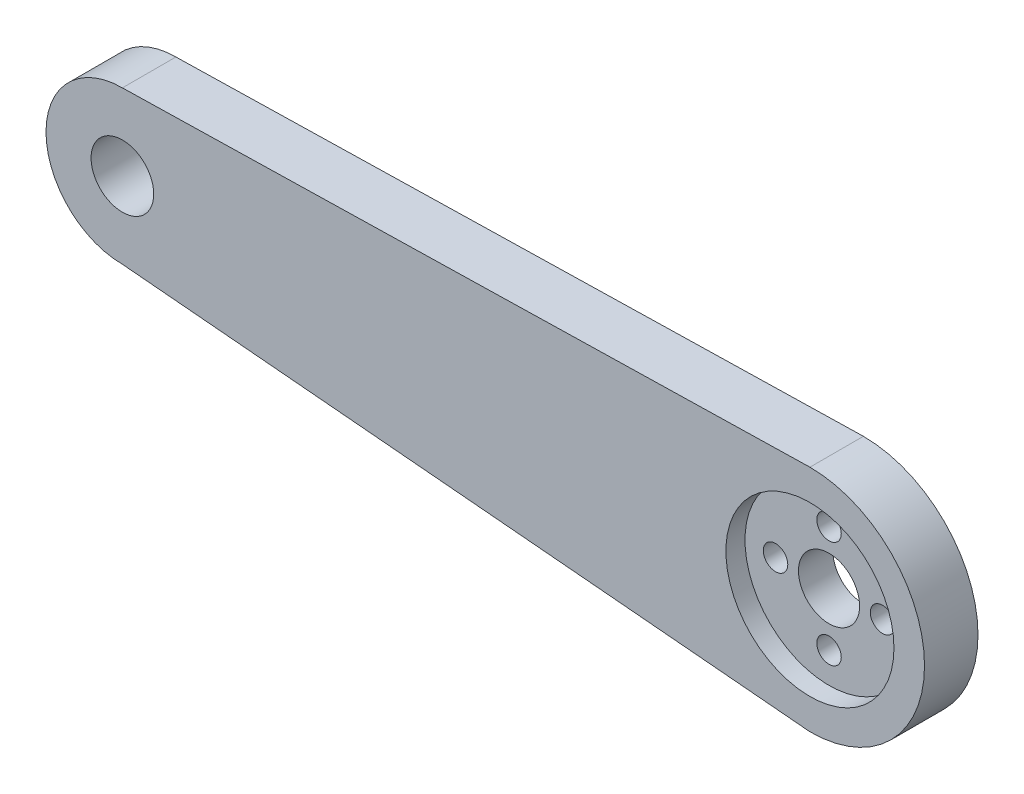
ISO-10303-21;
HEADER;
FILE_DESCRIPTION(('STEP AP214'),'2;1');
FILE_NAME('part.step','',(''),(''),'','','');
FILE_SCHEMA(('AUTOMOTIVE_DESIGN { 1 0 10303 214 1 1 1 1 }'));
ENDSEC;
DATA;
#1=APPLICATION_CONTEXT('core data for automotive mechanical design processes');
#2=APPLICATION_PROTOCOL_DEFINITION('international standard','automotive_design',2000,#1);
#3=PRODUCT_CONTEXT('',#1,'mechanical');
#4=PRODUCT('Part','Part','',(#3));
#5=PRODUCT_RELATED_PRODUCT_CATEGORY('part','',(#4));
#6=PRODUCT_DEFINITION_FORMATION('','',#4);
#7=PRODUCT_DEFINITION_CONTEXT('part definition',#1,'design');
#8=PRODUCT_DEFINITION('design','',#6,#7);
#9=PRODUCT_DEFINITION_SHAPE('','',#8);
#10=(LENGTH_UNIT() NAMED_UNIT(*) SI_UNIT(.MILLI.,.METRE.));
#11=(NAMED_UNIT(*) PLANE_ANGLE_UNIT() SI_UNIT($,.RADIAN.));
#12=(NAMED_UNIT(*) SI_UNIT($,.STERADIAN.) SOLID_ANGLE_UNIT());
#13=UNCERTAINTY_MEASURE_WITH_UNIT(LENGTH_MEASURE(1.E-05),#10,'distance_accuracy_value','');
#14=(GEOMETRIC_REPRESENTATION_CONTEXT(3) GLOBAL_UNCERTAINTY_ASSIGNED_CONTEXT((#13)) GLOBAL_UNIT_ASSIGNED_CONTEXT((#10,
#11,#12)) REPRESENTATION_CONTEXT('',''));
#15=CARTESIAN_POINT('',(0.,0.,0.));
#16=DIRECTION('',(0.,0.,1.));
#17=DIRECTION('',(1.,0.,0.));
#18=AXIS2_PLACEMENT_3D('',#15,#16,#17);
#19=CARTESIAN_POINT('',(90.,-3.00000000000001,10.));
#20=DIRECTION('',(0.,0.,-1.));
#21=DIRECTION('',(-1.,0.,0.));
#22=AXIS2_PLACEMENT_3D('',#19,#20,#21);
#23=CYLINDRICAL_SURFACE('',#22,4.00000000000001);
#24=CARTESIAN_POINT('',(90.,-3.00000000000001,0.));
#25=DIRECTION('',(0.,0.,-1.));
#26=DIRECTION('',(-1.,0.,0.));
#27=AXIS2_PLACEMENT_3D('',#24,#25,#26);
#28=CIRCLE('',#27,4.00000000000001);
#29=CARTESIAN_POINT('',(86.,-3.00000000000001,0.));
#30=VERTEX_POINT('',#29);
#31=EDGE_CURVE('E119',#30,#30,#28,.T.);
#32=ORIENTED_EDGE('',*,*,#31,.T.);
#33=EDGE_LOOP('',(#32));
#34=FACE_BOUND('',#33,.T.);
#35=CARTESIAN_POINT('',(90.,-3.00000000000001,4.5));
#36=DIRECTION('',(0.,0.,1.));
#37=DIRECTION('',(1.,0.,0.));
#38=AXIS2_PLACEMENT_3D('',#35,#36,#37);
#39=CIRCLE('',#38,4.00000000000001);
#40=CARTESIAN_POINT('',(94.,-3.00000000000001,4.5));
#41=VERTEX_POINT('',#40);
#42=EDGE_CURVE('E127',#41,#41,#39,.F.);
#43=ORIENTED_EDGE('',*,*,#42,.F.);
#44=EDGE_LOOP('',(#43));
#45=FACE_BOUND('',#44,.T.);
#46=ADVANCED_FACE('F37',(#34,#45),#23,.F.);
#47=CARTESIAN_POINT('',(90.,3.99999999999999,10.));
#48=DIRECTION('',(0.,0.,-1.));
#49=DIRECTION('',(-1.,0.,0.));
#50=AXIS2_PLACEMENT_3D('',#47,#48,#49);
#51=CYLINDRICAL_SURFACE('',#50,1.60000000000001);
#52=CARTESIAN_POINT('',(90.,3.99999999999999,0.));
#53=DIRECTION('',(0.,0.,-1.));
#54=DIRECTION('',(-1.,0.,0.));
#55=AXIS2_PLACEMENT_3D('',#52,#53,#54);
#56=CIRCLE('',#55,1.60000000000001);
#57=CARTESIAN_POINT('',(88.4,3.99999999999999,0.));
#58=VERTEX_POINT('',#57);
#59=EDGE_CURVE('E126',#58,#58,#56,.T.);
#60=ORIENTED_EDGE('',*,*,#59,.T.);
#61=EDGE_LOOP('',(#60));
#62=FACE_BOUND('',#61,.T.);
#63=CARTESIAN_POINT('',(90.,3.99999999999999,4.5));
#64=DIRECTION('',(0.,0.,1.));
#65=DIRECTION('',(1.,0.,0.));
#66=AXIS2_PLACEMENT_3D('',#63,#64,#65);
#67=CIRCLE('',#66,1.60000000000001);
#68=CARTESIAN_POINT('',(91.6,3.99999999999999,4.5));
#69=VERTEX_POINT('',#68);
#70=EDGE_CURVE('E140',#69,#69,#67,.F.);
#71=ORIENTED_EDGE('',*,*,#70,.F.);
#72=EDGE_LOOP('',(#71));
#73=FACE_BOUND('',#72,.T.);
#74=ADVANCED_FACE('F176',(#62,#73),#51,.F.);
#75=CARTESIAN_POINT('',(83.,-3.00000000000001,10.));
#76=DIRECTION('',(0.,0.,-1.));
#77=DIRECTION('',(-1.,0.,0.));
#78=AXIS2_PLACEMENT_3D('',#75,#76,#77);
#79=CYLINDRICAL_SURFACE('',#78,1.60000000000001);
#80=CARTESIAN_POINT('',(83.,-3.00000000000001,0.));
#81=DIRECTION('',(0.,0.,-1.));
#82=DIRECTION('',(-1.,0.,0.));
#83=AXIS2_PLACEMENT_3D('',#80,#81,#82);
#84=CIRCLE('',#83,1.60000000000001);
#85=CARTESIAN_POINT('',(81.4,-3.00000000000001,0.));
#86=VERTEX_POINT('',#85);
#87=EDGE_CURVE('E131',#86,#86,#84,.T.);
#88=ORIENTED_EDGE('',*,*,#87,.T.);
#89=EDGE_LOOP('',(#88));
#90=FACE_BOUND('',#89,.T.);
#91=CARTESIAN_POINT('',(83.,-3.00000000000001,4.5));
#92=DIRECTION('',(0.,0.,1.));
#93=DIRECTION('',(1.,0.,0.));
#94=AXIS2_PLACEMENT_3D('',#91,#92,#93);
#95=CIRCLE('',#94,1.60000000000001);
#96=CARTESIAN_POINT('',(84.6,-3.00000000000001,4.5));
#97=VERTEX_POINT('',#96);
#98=EDGE_CURVE('E143',#97,#97,#95,.F.);
#99=ORIENTED_EDGE('',*,*,#98,.F.);
#100=EDGE_LOOP('',(#99));
#101=FACE_BOUND('',#100,.T.);
#102=ADVANCED_FACE('F171',(#90,#101),#79,.F.);
#103=CARTESIAN_POINT('',(90.,-10.,10.));
#104=DIRECTION('',(0.,0.,-1.));
#105=DIRECTION('',(-1.,0.,0.));
#106=AXIS2_PLACEMENT_3D('',#103,#104,#105);
#107=CYLINDRICAL_SURFACE('',#106,1.6);
#108=CARTESIAN_POINT('',(90.,-10.,0.));
#109=DIRECTION('',(0.,0.,-1.));
#110=DIRECTION('',(-1.,0.,0.));
#111=AXIS2_PLACEMENT_3D('',#108,#109,#110);
#112=CIRCLE('',#111,1.6);
#113=CARTESIAN_POINT('',(88.4,-10.,0.));
#114=VERTEX_POINT('',#113);
#115=EDGE_CURVE('E128',#114,#114,#112,.T.);
#116=ORIENTED_EDGE('',*,*,#115,.T.);
#117=EDGE_LOOP('',(#116));
#118=FACE_BOUND('',#117,.T.);
#119=CARTESIAN_POINT('',(90.,-10.,4.5));
#120=DIRECTION('',(0.,0.,1.));
#121=DIRECTION('',(1.,0.,0.));
#122=AXIS2_PLACEMENT_3D('',#119,#120,#121);
#123=CIRCLE('',#122,1.6);
#124=CARTESIAN_POINT('',(91.6,-10.,4.5));
#125=VERTEX_POINT('',#124);
#126=EDGE_CURVE('E146',#125,#125,#123,.F.);
#127=ORIENTED_EDGE('',*,*,#126,.F.);
#128=EDGE_LOOP('',(#127));
#129=FACE_BOUND('',#128,.T.);
#130=ADVANCED_FACE('F164',(#118,#129),#107,.F.);
#131=CARTESIAN_POINT('',(97.,-3.,10.));
#132=DIRECTION('',(0.,0.,-1.));
#133=DIRECTION('',(-1.,0.,0.));
#134=AXIS2_PLACEMENT_3D('',#131,#132,#133);
#135=CYLINDRICAL_SURFACE('',#134,1.60000000000001);
#136=CARTESIAN_POINT('',(97.,-3.,0.));
#137=DIRECTION('',(0.,0.,-1.));
#138=DIRECTION('',(-1.,0.,0.));
#139=AXIS2_PLACEMENT_3D('',#136,#137,#138);
#140=CIRCLE('',#139,1.60000000000001);
#141=CARTESIAN_POINT('',(95.4,-3.,0.));
#142=VERTEX_POINT('',#141);
#143=EDGE_CURVE('E123',#142,#142,#140,.T.);
#144=ORIENTED_EDGE('',*,*,#143,.T.);
#145=EDGE_LOOP('',(#144));
#146=FACE_BOUND('',#145,.T.);
#147=CARTESIAN_POINT('',(97.,-3.,4.5));
#148=DIRECTION('',(0.,0.,1.));
#149=DIRECTION('',(1.,0.,0.));
#150=AXIS2_PLACEMENT_3D('',#147,#148,#149);
#151=CIRCLE('',#150,1.60000000000001);
#152=CARTESIAN_POINT('',(98.6,-3.,4.5));
#153=VERTEX_POINT('',#152);
#154=EDGE_CURVE('E41',#153,#153,#151,.F.);
#155=ORIENTED_EDGE('',*,*,#154,.F.);
#156=EDGE_LOOP('',(#155));
#157=FACE_BOUND('',#156,.T.);
#158=ADVANCED_FACE('F162',(#146,#157),#135,.F.);
#159=CARTESIAN_POINT('',(0.,0.,7.));
#160=DIRECTION('',(0.,0.,-1.));
#161=DIRECTION('',(-1.,0.,0.));
#162=AXIS2_PLACEMENT_3D('',#159,#160,#161);
#163=CYLINDRICAL_SURFACE('',#162,10.);
#164=CARTESIAN_POINT('',(0.,0.,0.));
#165=DIRECTION('',(0.,0.,1.));
#166=DIRECTION('',(1.,0.,0.));
#167=AXIS2_PLACEMENT_3D('',#164,#165,#166);
#168=CIRCLE('',#167,10.);
#169=CARTESIAN_POINT('',(0.,10.,0.));
#170=VERTEX_POINT('',#169);
#171=CARTESIAN_POINT('',(0.,-10.,0.));
#172=VERTEX_POINT('',#171);
#173=EDGE_CURVE('E103',#170,#172,#168,.T.);
#174=ORIENTED_EDGE('',*,*,#173,.T.);
#175=DIRECTION('',(0.,0.,-1.));
#176=VECTOR('',#175,1.);
#177=CARTESIAN_POINT('',(0.,-10.,7.));
#178=LINE('',#177,#176);
#179=CARTESIAN_POINT('',(0.,-10.,7.));
#180=VERTEX_POINT('',#179);
#181=EDGE_CURVE('E11',#180,#172,#178,.T.);
#182=ORIENTED_EDGE('',*,*,#181,.F.);
#183=CARTESIAN_POINT('',(0.,0.,7.));
#184=DIRECTION('',(0.,0.,1.));
#185=DIRECTION('',(1.,0.,0.));
#186=AXIS2_PLACEMENT_3D('',#183,#184,#185);
#187=CIRCLE('',#186,10.);
#188=CARTESIAN_POINT('',(0.,10.,7.));
#189=VERTEX_POINT('',#188);
#190=EDGE_CURVE('E90',#189,#180,#187,.T.);
#191=ORIENTED_EDGE('',*,*,#190,.F.);
#192=DIRECTION('',(0.,0.,-1.));
#193=VECTOR('',#192,1.);
#194=CARTESIAN_POINT('',(0.,10.,7.));
#195=LINE('',#194,#193);
#196=EDGE_CURVE('E99',#189,#170,#195,.T.);
#197=ORIENTED_EDGE('',*,*,#196,.T.);
#198=EDGE_LOOP('',(#174,#182,#191,#197));
#199=FACE_BOUND('',#198,.T.);
#200=ADVANCED_FACE('F39',(#199),#163,.T.);
#201=CARTESIAN_POINT('',(0.,-10.,7.));
#202=DIRECTION('',(0.0885397902837944,0.996072640692687,0.));
#203=DIRECTION('',(-0.996072640692687,0.0885397902837944,0.));
#204=AXIS2_PLACEMENT_3D('',#201,#202,#203);
#205=PLANE('',#204);
#206=DIRECTION('',(0.996072640692687,-0.0885397902837944,0.));
#207=VECTOR('',#206,1.);
#208=CARTESIAN_POINT('',(0.,-10.,0.));
#209=LINE('',#208,#207);
#210=CARTESIAN_POINT('',(90.,-18.,0.));
#211=VERTEX_POINT('',#210);
#212=EDGE_CURVE('E94',#172,#211,#209,.T.);
#213=ORIENTED_EDGE('',*,*,#212,.T.);
#214=DIRECTION('',(0.,0.,-1.));
#215=VECTOR('',#214,1.);
#216=CARTESIAN_POINT('',(90.,-18.,7.));
#217=LINE('',#216,#215);
#218=CARTESIAN_POINT('',(90.,-18.,7.));
#219=VERTEX_POINT('',#218);
#220=EDGE_CURVE('E47',#219,#211,#217,.T.);
#221=ORIENTED_EDGE('',*,*,#220,.F.);
#222=DIRECTION('',(0.996072640692687,-0.0885397902837944,0.));
#223=VECTOR('',#222,1.);
#224=CARTESIAN_POINT('',(0.,-10.,7.));
#225=LINE('',#224,#223);
#226=EDGE_CURVE('E85',#180,#219,#225,.T.);
#227=ORIENTED_EDGE('',*,*,#226,.F.);
#228=ORIENTED_EDGE('',*,*,#181,.T.);
#229=EDGE_LOOP('',(#213,#221,#227,#228));
#230=FACE_BOUND('',#229,.T.);
#231=ADVANCED_FACE('F93',(#230),#205,.F.);
#232=CARTESIAN_POINT('',(90.,-3.00000000000001,7.));
#233=DIRECTION('',(0.,0.,-1.));
#234=DIRECTION('',(-1.,0.,0.));
#235=AXIS2_PLACEMENT_3D('',#232,#233,#234);
#236=CYLINDRICAL_SURFACE('',#235,15.);
#237=CARTESIAN_POINT('',(90.,-3.00000000000001,0.));
#238=DIRECTION('',(0.,0.,1.));
#239=DIRECTION('',(1.,0.,0.));
#240=AXIS2_PLACEMENT_3D('',#237,#238,#239);
#241=CIRCLE('',#240,15.);
#242=CARTESIAN_POINT('',(90.,12.,0.));
#243=VERTEX_POINT('',#242);
#244=EDGE_CURVE('E72',#211,#243,#241,.T.);
#245=ORIENTED_EDGE('',*,*,#244,.T.);
#246=DIRECTION('',(0.,0.,-1.));
#247=VECTOR('',#246,1.);
#248=CARTESIAN_POINT('',(90.,12.,7.));
#249=LINE('',#248,#247);
#250=CARTESIAN_POINT('',(90.,12.,7.));
#251=VERTEX_POINT('',#250);
#252=EDGE_CURVE('E95',#251,#243,#249,.T.);
#253=ORIENTED_EDGE('',*,*,#252,.F.);
#254=CARTESIAN_POINT('',(90.,-3.00000000000001,7.));
#255=DIRECTION('',(0.,0.,1.));
#256=DIRECTION('',(1.,0.,0.));
#257=AXIS2_PLACEMENT_3D('',#254,#255,#256);
#258=CIRCLE('',#257,15.);
#259=EDGE_CURVE('E88',#219,#251,#258,.T.);
#260=ORIENTED_EDGE('',*,*,#259,.F.);
#261=ORIENTED_EDGE('',*,*,#220,.T.);
#262=EDGE_LOOP('',(#245,#253,#260,#261));
#263=FACE_BOUND('',#262,.T.);
#264=ADVANCED_FACE('F97',(#263),#236,.T.);
#265=CARTESIAN_POINT('',(0.,10.,7.));
#266=DIRECTION('',(0.0222167372851468,-0.99975317783161,0.));
#267=DIRECTION('',(0.99975317783161,0.0222167372851468,0.));
#268=AXIS2_PLACEMENT_3D('',#265,#266,#267);
#269=PLANE('',#268);
#270=DIRECTION('',(-0.99975317783161,-0.0222167372851468,0.));
#271=VECTOR('',#270,1.);
#272=CARTESIAN_POINT('',(0.,10.,0.));
#273=LINE('',#272,#271);
#274=EDGE_CURVE('E78',#243,#170,#273,.T.);
#275=ORIENTED_EDGE('',*,*,#274,.T.);
#276=ORIENTED_EDGE('',*,*,#196,.F.);
#277=DIRECTION('',(-0.99975317783161,-0.0222167372851468,0.));
#278=VECTOR('',#277,1.);
#279=CARTESIAN_POINT('',(0.,10.,7.));
#280=LINE('',#279,#278);
#281=EDGE_CURVE('E55',#251,#189,#280,.T.);
#282=ORIENTED_EDGE('',*,*,#281,.F.);
#283=ORIENTED_EDGE('',*,*,#252,.T.);
#284=EDGE_LOOP('',(#275,#276,#282,#283));
#285=FACE_BOUND('',#284,.T.);
#286=ADVANCED_FACE('F111',(#285),#269,.F.);
#287=CARTESIAN_POINT('',(0.,0.,7.));
#288=DIRECTION('',(0.,0.,1.));
#289=DIRECTION('',(1.,0.,0.));
#290=AXIS2_PLACEMENT_3D('',#287,#288,#289);
#291=PLANE('',#290);
#292=CARTESIAN_POINT('',(90.,-3.00000000000001,7.));
#293=DIRECTION('',(0.,0.,1.));
#294=DIRECTION('',(1.,0.,0.));
#295=AXIS2_PLACEMENT_3D('',#292,#293,#294);
#296=CIRCLE('',#295,11.);
#297=CARTESIAN_POINT('',(101.,-3.00000000000001,7.));
#298=VERTEX_POINT('',#297);
#299=EDGE_CURVE('E149',#298,#298,#296,.T.);
#300=ORIENTED_EDGE('',*,*,#299,.F.);
#301=EDGE_LOOP('',(#300));
#302=FACE_BOUND('',#301,.T.);
#303=CARTESIAN_POINT('',(0.,0.,7.));
#304=DIRECTION('',(0.,0.,1.));
#305=DIRECTION('',(1.,0.,0.));
#306=AXIS2_PLACEMENT_3D('',#303,#304,#305);
#307=CIRCLE('',#306,4.1);
#308=CARTESIAN_POINT('',(4.1,0.,7.));
#309=VERTEX_POINT('',#308);
#310=EDGE_CURVE('E106',#309,#309,#307,.T.);
#311=ORIENTED_EDGE('',*,*,#310,.F.);
#312=EDGE_LOOP('',(#311));
#313=FACE_BOUND('',#312,.T.);
#314=ORIENTED_EDGE('',*,*,#190,.T.);
#315=ORIENTED_EDGE('',*,*,#226,.T.);
#316=ORIENTED_EDGE('',*,*,#259,.T.);
#317=ORIENTED_EDGE('',*,*,#281,.T.);
#318=EDGE_LOOP('',(#314,#315,#316,#317));
#319=FACE_BOUND('',#318,.T.);
#320=ADVANCED_FACE('F86',(#302,#313,#319),#291,.T.);
#321=CARTESIAN_POINT('',(0.,0.,0.));
#322=DIRECTION('',(0.,0.,1.));
#323=DIRECTION('',(1.,0.,0.));
#324=AXIS2_PLACEMENT_3D('',#321,#322,#323);
#325=PLANE('',#324);
#326=ORIENTED_EDGE('',*,*,#143,.F.);
#327=EDGE_LOOP('',(#326));
#328=FACE_BOUND('',#327,.T.);
#329=CARTESIAN_POINT('',(0.,0.,0.));
#330=DIRECTION('',(0.,0.,-1.));
#331=DIRECTION('',(-1.,0.,0.));
#332=AXIS2_PLACEMENT_3D('',#329,#330,#331);
#333=CIRCLE('',#332,4.1);
#334=CARTESIAN_POINT('',(-4.1,0.,0.));
#335=VERTEX_POINT('',#334);
#336=EDGE_CURVE('E122',#335,#335,#333,.T.);
#337=ORIENTED_EDGE('',*,*,#336,.F.);
#338=EDGE_LOOP('',(#337));
#339=FACE_BOUND('',#338,.T.);
#340=ORIENTED_EDGE('',*,*,#115,.F.);
#341=EDGE_LOOP('',(#340));
#342=FACE_BOUND('',#341,.T.);
#343=ORIENTED_EDGE('',*,*,#87,.F.);
#344=EDGE_LOOP('',(#343));
#345=FACE_BOUND('',#344,.T.);
#346=ORIENTED_EDGE('',*,*,#59,.F.);
#347=EDGE_LOOP('',(#346));
#348=FACE_BOUND('',#347,.T.);
#349=ORIENTED_EDGE('',*,*,#31,.F.);
#350=EDGE_LOOP('',(#349));
#351=FACE_BOUND('',#350,.T.);
#352=ORIENTED_EDGE('',*,*,#173,.F.);
#353=ORIENTED_EDGE('',*,*,#274,.F.);
#354=ORIENTED_EDGE('',*,*,#244,.F.);
#355=ORIENTED_EDGE('',*,*,#212,.F.);
#356=EDGE_LOOP('',(#352,#353,#354,#355));
#357=FACE_BOUND('',#356,.T.);
#358=ADVANCED_FACE('F114',(#328,#339,#342,#345,#348,#351,#357),#325,.F.);
#359=CARTESIAN_POINT('',(0.,0.,10.));
#360=DIRECTION('',(0.,0.,-1.));
#361=DIRECTION('',(-1.,0.,0.));
#362=AXIS2_PLACEMENT_3D('',#359,#360,#361);
#363=CYLINDRICAL_SURFACE('',#362,4.1);
#364=ORIENTED_EDGE('',*,*,#310,.T.);
#365=EDGE_LOOP('',(#364));
#366=FACE_BOUND('',#365,.T.);
#367=ORIENTED_EDGE('',*,*,#336,.T.);
#368=EDGE_LOOP('',(#367));
#369=FACE_BOUND('',#368,.T.);
#370=ADVANCED_FACE('F190',(#366,#369),#363,.F.);
#371=CARTESIAN_POINT('',(90.,-3.00000000000001,4.5));
#372=DIRECTION('',(0.,0.,1.));
#373=DIRECTION('',(1.,0.,0.));
#374=AXIS2_PLACEMENT_3D('',#371,#372,#373);
#375=PLANE('',#374);
#376=CARTESIAN_POINT('',(90.,-3.00000000000001,4.5));
#377=DIRECTION('',(0.,0.,1.));
#378=DIRECTION('',(1.,0.,0.));
#379=AXIS2_PLACEMENT_3D('',#376,#377,#378);
#380=CIRCLE('',#379,11.);
#381=CARTESIAN_POINT('',(101.,-3.00000000000001,4.5));
#382=VERTEX_POINT('',#381);
#383=EDGE_CURVE('E152',#382,#382,#380,.T.);
#384=ORIENTED_EDGE('',*,*,#383,.T.);
#385=EDGE_LOOP('',(#384));
#386=FACE_BOUND('',#385,.T.);
#387=ORIENTED_EDGE('',*,*,#154,.T.);
#388=EDGE_LOOP('',(#387));
#389=FACE_BOUND('',#388,.T.);
#390=ORIENTED_EDGE('',*,*,#126,.T.);
#391=EDGE_LOOP('',(#390));
#392=FACE_BOUND('',#391,.T.);
#393=ORIENTED_EDGE('',*,*,#98,.T.);
#394=EDGE_LOOP('',(#393));
#395=FACE_BOUND('',#394,.T.);
#396=ORIENTED_EDGE('',*,*,#70,.T.);
#397=EDGE_LOOP('',(#396));
#398=FACE_BOUND('',#397,.T.);
#399=ORIENTED_EDGE('',*,*,#42,.T.);
#400=EDGE_LOOP('',(#399));
#401=FACE_BOUND('',#400,.T.);
#402=ADVANCED_FACE('F159',(#386,#389,#392,#395,#398,#401),#375,.T.);
#403=CARTESIAN_POINT('',(90.,-3.00000000000001,4.5));
#404=DIRECTION('',(0.,0.,1.));
#405=DIRECTION('',(1.,0.,0.));
#406=AXIS2_PLACEMENT_3D('',#403,#404,#405);
#407=CYLINDRICAL_SURFACE('',#406,11.);
#408=ORIENTED_EDGE('',*,*,#383,.F.);
#409=EDGE_LOOP('',(#408));
#410=FACE_BOUND('',#409,.T.);
#411=ORIENTED_EDGE('',*,*,#299,.T.);
#412=EDGE_LOOP('',(#411));
#413=FACE_BOUND('',#412,.T.);
#414=ADVANCED_FACE('F229',(#410,#413),#407,.F.);
#415=CLOSED_SHELL('',(#46,#74,#102,#130,#158,#200,#231,#264,#286,#320,#358,#370,#402,#414));
#416=MANIFOLD_SOLID_BREP('B2',#415);
#417=ADVANCED_BREP_SHAPE_REPRESENTATION('',(#18,#416),#14);
#418=SHAPE_DEFINITION_REPRESENTATION(#9,#417);
ENDSEC;
END-ISO-10303-21;
